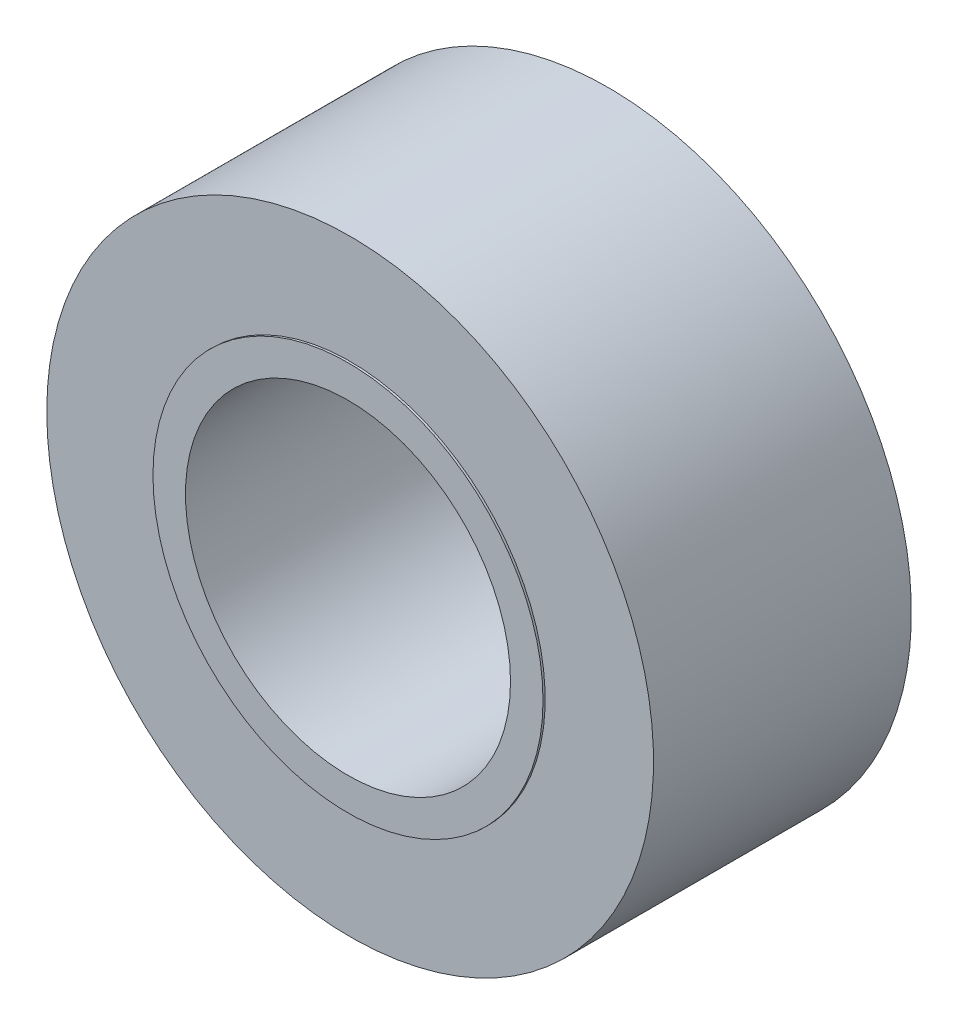
ISO-10303-21;
HEADER;
FILE_DESCRIPTION(('STEP AP214'),'2;1');
FILE_NAME('part.step','',(''),(''),'','','');
FILE_SCHEMA(('AUTOMOTIVE_DESIGN { 1 0 10303 214 1 1 1 1 }'));
ENDSEC;
DATA;
#1=APPLICATION_CONTEXT('core data for automotive mechanical design processes');
#2=APPLICATION_PROTOCOL_DEFINITION('international standard','automotive_design',2000,#1);
#3=PRODUCT_CONTEXT('',#1,'mechanical');
#4=PRODUCT('Part','Part','',(#3));
#5=PRODUCT_RELATED_PRODUCT_CATEGORY('part','',(#4));
#6=PRODUCT_DEFINITION_FORMATION('','',#4);
#7=PRODUCT_DEFINITION_CONTEXT('part definition',#1,'design');
#8=PRODUCT_DEFINITION('design','',#6,#7);
#9=PRODUCT_DEFINITION_SHAPE('','',#8);
#10=(LENGTH_UNIT() NAMED_UNIT(*) SI_UNIT(.MILLI.,.METRE.));
#11=(NAMED_UNIT(*) PLANE_ANGLE_UNIT() SI_UNIT($,.RADIAN.));
#12=(NAMED_UNIT(*) SI_UNIT($,.STERADIAN.) SOLID_ANGLE_UNIT());
#13=UNCERTAINTY_MEASURE_WITH_UNIT(LENGTH_MEASURE(1.E-05),#10,'distance_accuracy_value','');
#14=(GEOMETRIC_REPRESENTATION_CONTEXT(3) GLOBAL_UNCERTAINTY_ASSIGNED_CONTEXT((#13)) GLOBAL_UNIT_ASSIGNED_CONTEXT((#10,
#11,#12)) REPRESENTATION_CONTEXT('',''));
#15=CARTESIAN_POINT('',(0.,0.,0.));
#16=DIRECTION('',(0.,0.,1.));
#17=DIRECTION('',(1.,0.,0.));
#18=AXIS2_PLACEMENT_3D('',#15,#16,#17);
#19=CARTESIAN_POINT('',(0.,0.,0.));
#20=DIRECTION('',(0.,0.,1.));
#21=DIRECTION('',(1.,0.,0.));
#22=AXIS2_PLACEMENT_3D('',#19,#20,#21);
#23=PLANE('',#22);
#24=CARTESIAN_POINT('',(0.,0.,0.));
#25=DIRECTION('',(0.,0.,1.));
#26=DIRECTION('',(1.,0.,0.));
#27=AXIS2_PLACEMENT_3D('',#24,#25,#26);
#28=CIRCLE('',#27,7.5);
#29=CARTESIAN_POINT('',(7.5,0.,0.));
#30=VERTEX_POINT('',#29);
#31=EDGE_CURVE('E64',#30,#30,#28,.T.);
#32=ORIENTED_EDGE('',*,*,#31,.T.);
#33=EDGE_LOOP('',(#32));
#34=FACE_BOUND('',#33,.T.);
#35=CARTESIAN_POINT('',(0.,0.,0.));
#36=DIRECTION('',(0.,0.,-1.));
#37=DIRECTION('',(-1.,0.,0.));
#38=AXIS2_PLACEMENT_3D('',#35,#36,#37);
#39=CIRCLE('',#38,14.);
#40=CARTESIAN_POINT('',(-14.,0.,0.));
#41=VERTEX_POINT('',#40);
#42=EDGE_CURVE('E75',#41,#41,#39,.T.);
#43=ORIENTED_EDGE('',*,*,#42,.T.);
#44=EDGE_LOOP('',(#43));
#45=FACE_BOUND('',#44,.T.);
#46=ADVANCED_FACE('F39',(#34,#45),#23,.F.);
#47=CARTESIAN_POINT('',(0.,0.,-0.1));
#48=DIRECTION('',(0.,0.,1.));
#49=DIRECTION('',(1.,0.,0.));
#50=AXIS2_PLACEMENT_3D('',#47,#48,#49);
#51=PLANE('',#50);
#52=CARTESIAN_POINT('',(0.,0.,-0.0999999999999998));
#53=DIRECTION('',(0.,0.,1.));
#54=DIRECTION('',(1.,0.,0.));
#55=AXIS2_PLACEMENT_3D('',#52,#53,#54);
#56=CIRCLE('',#55,5.2);
#57=CARTESIAN_POINT('',(5.2,0.,-0.0999999999999998));
#58=VERTEX_POINT('',#57);
#59=EDGE_CURVE('E54',#58,#58,#56,.T.);
#60=ORIENTED_EDGE('',*,*,#59,.T.);
#61=EDGE_LOOP('',(#60));
#62=FACE_BOUND('',#61,.T.);
#63=CARTESIAN_POINT('',(0.,0.,-0.1));
#64=DIRECTION('',(0.,0.,1.));
#65=DIRECTION('',(1.,0.,0.));
#66=AXIS2_PLACEMENT_3D('',#63,#64,#65);
#67=CIRCLE('',#66,7.5);
#68=CARTESIAN_POINT('',(7.5,0.,-0.1));
#69=VERTEX_POINT('',#68);
#70=EDGE_CURVE('E56',#69,#69,#67,.T.);
#71=ORIENTED_EDGE('',*,*,#70,.F.);
#72=EDGE_LOOP('',(#71));
#73=FACE_BOUND('',#72,.T.);
#74=ADVANCED_FACE('F97',(#62,#73),#51,.F.);
#75=CARTESIAN_POINT('',(0.,0.,-0.1));
#76=DIRECTION('',(0.,0.,1.));
#77=DIRECTION('',(1.,0.,0.));
#78=AXIS2_PLACEMENT_3D('',#75,#76,#77);
#79=CYLINDRICAL_SURFACE('',#78,7.5);
#80=ORIENTED_EDGE('',*,*,#70,.T.);
#81=EDGE_LOOP('',(#80));
#82=FACE_BOUND('',#81,.T.);
#83=ORIENTED_EDGE('',*,*,#31,.F.);
#84=EDGE_LOOP('',(#83));
#85=FACE_BOUND('',#84,.T.);
#86=ADVANCED_FACE('F103',(#82,#85),#79,.T.);
#87=CARTESIAN_POINT('',(0.,0.,-3.));
#88=DIRECTION('',(0.,0.,1.));
#89=DIRECTION('',(1.,0.,0.));
#90=AXIS2_PLACEMENT_3D('',#87,#88,#89);
#91=CYLINDRICAL_SURFACE('',#90,5.2);
#92=CARTESIAN_POINT('',(0.,0.,-3.));
#93=DIRECTION('',(0.,0.,1.));
#94=DIRECTION('',(1.,0.,0.));
#95=AXIS2_PLACEMENT_3D('',#92,#93,#94);
#96=CIRCLE('',#95,5.2);
#97=CARTESIAN_POINT('',(5.2,0.,-3.));
#98=VERTEX_POINT('',#97);
#99=EDGE_CURVE('E57',#98,#98,#96,.T.);
#100=ORIENTED_EDGE('',*,*,#99,.T.);
#101=EDGE_LOOP('',(#100));
#102=FACE_BOUND('',#101,.T.);
#103=ORIENTED_EDGE('',*,*,#59,.F.);
#104=EDGE_LOOP('',(#103));
#105=FACE_BOUND('',#104,.T.);
#106=ADVANCED_FACE('F146',(#102,#105),#91,.T.);
#107=CARTESIAN_POINT('',(0.,0.,-3.));
#108=DIRECTION('',(0.,0.,1.));
#109=DIRECTION('',(1.,0.,0.));
#110=AXIS2_PLACEMENT_3D('',#107,#108,#109);
#111=CYLINDRICAL_SURFACE('',#110,1.5);
#112=CARTESIAN_POINT('',(0.,0.,-3.));
#113=DIRECTION('',(0.,0.,1.));
#114=DIRECTION('',(1.,0.,0.));
#115=AXIS2_PLACEMENT_3D('',#112,#113,#114);
#116=CIRCLE('',#115,1.5);
#117=CARTESIAN_POINT('',(1.5,0.,-3.));
#118=VERTEX_POINT('',#117);
#119=EDGE_CURVE('E71',#118,#118,#116,.T.);
#120=ORIENTED_EDGE('',*,*,#119,.F.);
#121=EDGE_LOOP('',(#120));
#122=FACE_BOUND('',#121,.T.);
#123=CARTESIAN_POINT('',(0.,0.,1.));
#124=DIRECTION('',(0.,0.,1.));
#125=DIRECTION('',(1.,0.,0.));
#126=AXIS2_PLACEMENT_3D('',#123,#124,#125);
#127=CIRCLE('',#126,1.5);
#128=CARTESIAN_POINT('',(1.5,0.,1.));
#129=VERTEX_POINT('',#128);
#130=EDGE_CURVE('E43',#129,#129,#127,.T.);
#131=ORIENTED_EDGE('',*,*,#130,.T.);
#132=EDGE_LOOP('',(#131));
#133=FACE_BOUND('',#132,.T.);
#134=ADVANCED_FACE('F142',(#122,#133),#111,.F.);
#135=CARTESIAN_POINT('',(0.,0.,-3.));
#136=DIRECTION('',(0.,0.,1.));
#137=DIRECTION('',(1.,0.,0.));
#138=AXIS2_PLACEMENT_3D('',#135,#136,#137);
#139=PLANE('',#138);
#140=ORIENTED_EDGE('',*,*,#119,.T.);
#141=EDGE_LOOP('',(#140));
#142=FACE_BOUND('',#141,.T.);
#143=ORIENTED_EDGE('',*,*,#99,.F.);
#144=EDGE_LOOP('',(#143));
#145=FACE_BOUND('',#144,.T.);
#146=ADVANCED_FACE('F94',(#142,#145),#139,.F.);
#147=CARTESIAN_POINT('',(0.,0.,11.9));
#148=DIRECTION('',(0.,0.,-1.));
#149=DIRECTION('',(-1.,0.,0.));
#150=AXIS2_PLACEMENT_3D('',#147,#148,#149);
#151=CYLINDRICAL_SURFACE('',#150,14.);
#152=CARTESIAN_POINT('',(0.,0.,11.9));
#153=DIRECTION('',(0.,0.,-1.));
#154=DIRECTION('',(-1.,0.,0.));
#155=AXIS2_PLACEMENT_3D('',#152,#153,#154);
#156=CIRCLE('',#155,14.);
#157=CARTESIAN_POINT('',(-14.,0.,11.9));
#158=VERTEX_POINT('',#157);
#159=EDGE_CURVE('E74',#158,#158,#156,.T.);
#160=ORIENTED_EDGE('',*,*,#159,.T.);
#161=EDGE_LOOP('',(#160));
#162=FACE_BOUND('',#161,.T.);
#163=ORIENTED_EDGE('',*,*,#42,.F.);
#164=EDGE_LOOP('',(#163));
#165=FACE_BOUND('',#164,.T.);
#166=ADVANCED_FACE('F81',(#162,#165),#151,.T.);
#167=CARTESIAN_POINT('',(0.,0.,11.9));
#168=DIRECTION('',(0.,0.,-1.));
#169=DIRECTION('',(-1.,0.,0.));
#170=AXIS2_PLACEMENT_3D('',#167,#168,#169);
#171=PLANE('',#170);
#172=CARTESIAN_POINT('',(0.,0.,11.9));
#173=DIRECTION('',(0.,0.,-1.));
#174=DIRECTION('',(-1.,0.,0.));
#175=AXIS2_PLACEMENT_3D('',#172,#173,#174);
#176=CIRCLE('',#175,9.);
#177=CARTESIAN_POINT('',(-9.,0.,11.9));
#178=VERTEX_POINT('',#177);
#179=EDGE_CURVE('E11',#178,#178,#176,.T.);
#180=ORIENTED_EDGE('',*,*,#179,.T.);
#181=EDGE_LOOP('',(#180));
#182=FACE_BOUND('',#181,.T.);
#183=ORIENTED_EDGE('',*,*,#159,.F.);
#184=EDGE_LOOP('',(#183));
#185=FACE_BOUND('',#184,.T.);
#186=ADVANCED_FACE('F84',(#182,#185),#171,.F.);
#187=CARTESIAN_POINT('',(0.,0.,1.));
#188=DIRECTION('',(0.,0.,1.));
#189=DIRECTION('',(1.,0.,0.));
#190=AXIS2_PLACEMENT_3D('',#187,#188,#189);
#191=PLANE('',#190);
#192=ORIENTED_EDGE('',*,*,#130,.F.);
#193=EDGE_LOOP('',(#192));
#194=FACE_BOUND('',#193,.T.);
#195=CARTESIAN_POINT('',(0.,0.,1.));
#196=DIRECTION('',(0.,0.,1.));
#197=DIRECTION('',(1.,0.,0.));
#198=AXIS2_PLACEMENT_3D('',#195,#196,#197);
#199=CIRCLE('',#198,7.5);
#200=CARTESIAN_POINT('',(7.5,0.,1.));
#201=VERTEX_POINT('',#200);
#202=EDGE_CURVE('E47',#201,#201,#199,.T.);
#203=ORIENTED_EDGE('',*,*,#202,.T.);
#204=EDGE_LOOP('',(#203));
#205=FACE_BOUND('',#204,.T.);
#206=ADVANCED_FACE('F86',(#194,#205),#191,.T.);
#207=CARTESIAN_POINT('',(0.,0.,12.));
#208=DIRECTION('',(0.,0.,-1.));
#209=DIRECTION('',(-1.,0.,0.));
#210=AXIS2_PLACEMENT_3D('',#207,#208,#209);
#211=CYLINDRICAL_SURFACE('',#210,7.5);
#212=ORIENTED_EDGE('',*,*,#202,.F.);
#213=EDGE_LOOP('',(#212));
#214=FACE_BOUND('',#213,.T.);
#215=CARTESIAN_POINT('',(0.,0.,12.));
#216=DIRECTION('',(0.,0.,1.));
#217=DIRECTION('',(1.,0.,0.));
#218=AXIS2_PLACEMENT_3D('',#215,#216,#217);
#219=CIRCLE('',#218,7.5);
#220=CARTESIAN_POINT('',(7.5,0.,12.));
#221=VERTEX_POINT('',#220);
#222=EDGE_CURVE('E61',#221,#221,#219,.T.);
#223=ORIENTED_EDGE('',*,*,#222,.T.);
#224=EDGE_LOOP('',(#223));
#225=FACE_BOUND('',#224,.T.);
#226=ADVANCED_FACE('F41',(#214,#225),#211,.F.);
#227=CARTESIAN_POINT('',(0.,0.,12.));
#228=DIRECTION('',(0.,0.,1.));
#229=DIRECTION('',(1.,0.,0.));
#230=AXIS2_PLACEMENT_3D('',#227,#228,#229);
#231=PLANE('',#230);
#232=ORIENTED_EDGE('',*,*,#222,.F.);
#233=EDGE_LOOP('',(#232));
#234=FACE_BOUND('',#233,.T.);
#235=CARTESIAN_POINT('',(0.,0.,12.));
#236=DIRECTION('',(0.,0.,1.));
#237=DIRECTION('',(1.,0.,0.));
#238=AXIS2_PLACEMENT_3D('',#235,#236,#237);
#239=CIRCLE('',#238,9.);
#240=CARTESIAN_POINT('',(9.,0.,12.));
#241=VERTEX_POINT('',#240);
#242=EDGE_CURVE('E51',#241,#241,#239,.T.);
#243=ORIENTED_EDGE('',*,*,#242,.T.);
#244=EDGE_LOOP('',(#243));
#245=FACE_BOUND('',#244,.T.);
#246=ADVANCED_FACE('F108',(#234,#245),#231,.T.);
#247=CARTESIAN_POINT('',(0.,0.,12.));
#248=DIRECTION('',(0.,0.,-1.));
#249=DIRECTION('',(-1.,0.,0.));
#250=AXIS2_PLACEMENT_3D('',#247,#248,#249);
#251=CYLINDRICAL_SURFACE('',#250,9.);
#252=ORIENTED_EDGE('',*,*,#242,.F.);
#253=EDGE_LOOP('',(#252));
#254=FACE_BOUND('',#253,.T.);
#255=ORIENTED_EDGE('',*,*,#179,.F.);
#256=EDGE_LOOP('',(#255));
#257=FACE_BOUND('',#256,.T.);
#258=ADVANCED_FACE('F110',(#254,#257),#251,.T.);
#259=CLOSED_SHELL('',(#46,#74,#86,#106,#134,#146,#166,#186,#206,#226,#246,#258));
#260=MANIFOLD_SOLID_BREP('B2',#259);
#261=ADVANCED_BREP_SHAPE_REPRESENTATION('',(#18,#260),#14);
#262=SHAPE_DEFINITION_REPRESENTATION(#9,#261);
ENDSEC;
END-ISO-10303-21;
